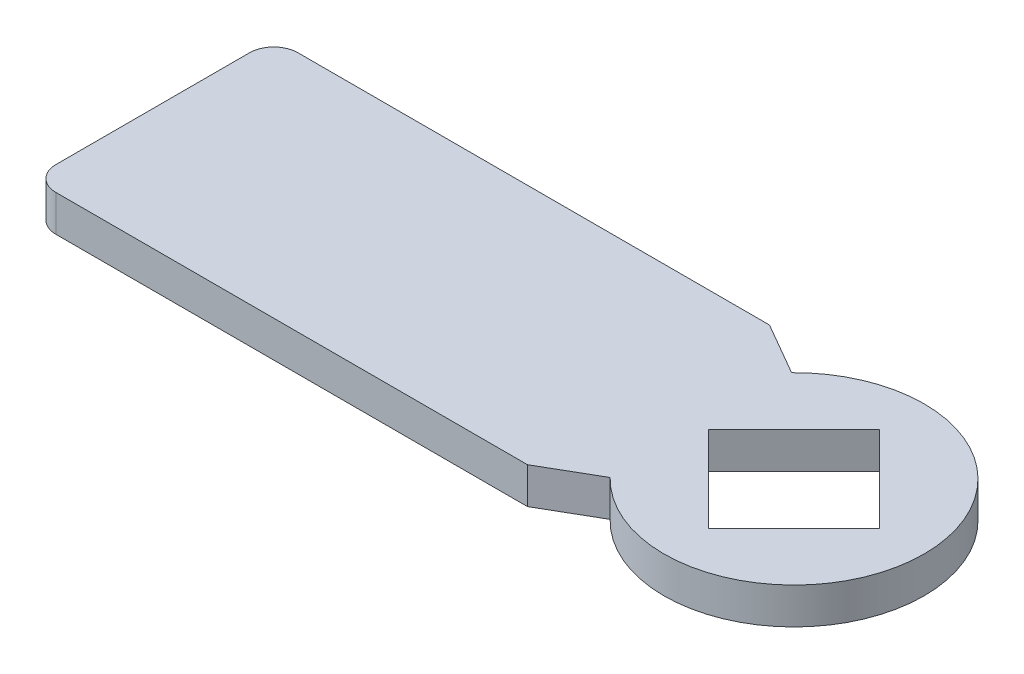
ISO-10303-21;
HEADER;
FILE_DESCRIPTION(('STEP AP214'),'2;1');
FILE_NAME('part.step','',(''),(''),'','','');
FILE_SCHEMA(('AUTOMOTIVE_DESIGN { 1 0 10303 214 1 1 1 1 }'));
ENDSEC;
DATA;
#1=APPLICATION_CONTEXT('core data for automotive mechanical design processes');
#2=APPLICATION_PROTOCOL_DEFINITION('international standard','automotive_design',2000,#1);
#3=PRODUCT_CONTEXT('',#1,'mechanical');
#4=PRODUCT('Part','Part','',(#3));
#5=PRODUCT_RELATED_PRODUCT_CATEGORY('part','',(#4));
#6=PRODUCT_DEFINITION_FORMATION('','',#4);
#7=PRODUCT_DEFINITION_CONTEXT('part definition',#1,'design');
#8=PRODUCT_DEFINITION('design','',#6,#7);
#9=PRODUCT_DEFINITION_SHAPE('','',#8);
#10=(LENGTH_UNIT() NAMED_UNIT(*) SI_UNIT(.MILLI.,.METRE.));
#11=(NAMED_UNIT(*) PLANE_ANGLE_UNIT() SI_UNIT($,.RADIAN.));
#12=(NAMED_UNIT(*) SI_UNIT($,.STERADIAN.) SOLID_ANGLE_UNIT());
#13=UNCERTAINTY_MEASURE_WITH_UNIT(LENGTH_MEASURE(1.E-05),#10,'distance_accuracy_value','');
#14=(GEOMETRIC_REPRESENTATION_CONTEXT(3) GLOBAL_UNCERTAINTY_ASSIGNED_CONTEXT((#13)) GLOBAL_UNIT_ASSIGNED_CONTEXT((#10,
#11,#12)) REPRESENTATION_CONTEXT('',''));
#15=CARTESIAN_POINT('',(0.,0.,0.));
#16=DIRECTION('',(0.,0.,1.));
#17=DIRECTION('',(1.,0.,0.));
#18=AXIS2_PLACEMENT_3D('',#15,#16,#17);
#19=CARTESIAN_POINT('',(-53.,3.,-10.));
#20=DIRECTION('',(1.,0.,0.));
#21=DIRECTION('',(0.,0.,-1.));
#22=AXIS2_PLACEMENT_3D('',#19,#20,#21);
#23=PLANE('',#22);
#24=DIRECTION('',(0.,0.,1.));
#25=VECTOR('',#24,1.);
#26=CARTESIAN_POINT('',(-53.,3.,-10.));
#27=LINE('',#26,#25);
#28=CARTESIAN_POINT('',(-53.,3.,-8.));
#29=VERTEX_POINT('',#28);
#30=CARTESIAN_POINT('',(-53.,3.,8.));
#31=VERTEX_POINT('',#30);
#32=EDGE_CURVE('E162',#29,#31,#27,.T.);
#33=ORIENTED_EDGE('',*,*,#32,.F.);
#34=DIRECTION('',(0.,-1.,0.));
#35=VECTOR('',#34,1.);
#36=CARTESIAN_POINT('',(-53.,3.,-8.));
#37=LINE('',#36,#35);
#38=CARTESIAN_POINT('',(-53.,0.,-8.));
#39=VERTEX_POINT('',#38);
#40=EDGE_CURVE('E203',#29,#39,#37,.T.);
#41=ORIENTED_EDGE('',*,*,#40,.T.);
#42=DIRECTION('',(0.,0.,1.));
#43=VECTOR('',#42,1.);
#44=CARTESIAN_POINT('',(-53.,0.,-10.));
#45=LINE('',#44,#43);
#46=CARTESIAN_POINT('',(-53.,0.,8.));
#47=VERTEX_POINT('',#46);
#48=EDGE_CURVE('E158',#39,#47,#45,.T.);
#49=ORIENTED_EDGE('',*,*,#48,.T.);
#50=DIRECTION('',(0.,-1.,0.));
#51=VECTOR('',#50,1.);
#52=CARTESIAN_POINT('',(-53.,3.,8.));
#53=LINE('',#52,#51);
#54=EDGE_CURVE('E201',#47,#31,#53,.F.);
#55=ORIENTED_EDGE('',*,*,#54,.T.);
#56=EDGE_LOOP('',(#33,#41,#49,#55));
#57=FACE_BOUND('',#56,.T.);
#58=ADVANCED_FACE('F36',(#57),#23,.F.);
#59=CARTESIAN_POINT('',(-53.,3.,10.));
#60=DIRECTION('',(0.,0.,-1.));
#61=DIRECTION('',(-1.,0.,0.));
#62=AXIS2_PLACEMENT_3D('',#59,#60,#61);
#63=PLANE('',#62);
#64=DIRECTION('',(1.,0.,0.));
#65=VECTOR('',#64,1.);
#66=CARTESIAN_POINT('',(-53.,3.,10.));
#67=LINE('',#66,#65);
#68=CARTESIAN_POINT('',(-51.,3.,10.));
#69=VERTEX_POINT('',#68);
#70=CARTESIAN_POINT('',(-12.0315879192969,3.,9.99999999999999));
#71=VERTEX_POINT('',#70);
#72=EDGE_CURVE('E165',#69,#71,#67,.T.);
#73=ORIENTED_EDGE('',*,*,#72,.F.);
#74=DIRECTION('',(0.,-1.,0.));
#75=VECTOR('',#74,1.);
#76=CARTESIAN_POINT('',(-51.,3.,10.));
#77=LINE('',#76,#75);
#78=CARTESIAN_POINT('',(-51.,0.,10.));
#79=VERTEX_POINT('',#78);
#80=EDGE_CURVE('E11',#69,#79,#77,.T.);
#81=ORIENTED_EDGE('',*,*,#80,.T.);
#82=DIRECTION('',(1.,0.,0.));
#83=VECTOR('',#82,1.);
#84=CARTESIAN_POINT('',(-53.,0.,10.));
#85=LINE('',#84,#83);
#86=CARTESIAN_POINT('',(-12.0315879192969,0.,9.99999999999999));
#87=VERTEX_POINT('',#86);
#88=EDGE_CURVE('E180',#79,#87,#85,.T.);
#89=ORIENTED_EDGE('',*,*,#88,.T.);
#90=DIRECTION('',(0.,-1.,0.));
#91=VECTOR('',#90,1.);
#92=CARTESIAN_POINT('',(-12.0315879192969,3.,9.99999999999999));
#93=LINE('',#92,#91);
#94=EDGE_CURVE('E198',#71,#87,#93,.T.);
#95=ORIENTED_EDGE('',*,*,#94,.F.);
#96=EDGE_LOOP('',(#73,#81,#89,#95));
#97=FACE_BOUND('',#96,.T.);
#98=ADVANCED_FACE('F248',(#97),#63,.F.);
#99=CARTESIAN_POINT('',(-12.0315879192969,3.,9.99999999999999));
#100=DIRECTION('',(-0.500000000000001,0.,-0.866025403784438));
#101=DIRECTION('',(-0.866025403784438,0.,0.500000000000001));
#102=AXIS2_PLACEMENT_3D('',#99,#100,#101);
#103=PLANE('',#102);
#104=DIRECTION('',(0.866025403784438,0.,-0.500000000000001));
#105=VECTOR('',#104,1.);
#106=CARTESIAN_POINT('',(-12.0315879192969,0.,9.99999999999999));
#107=LINE('',#106,#105);
#108=CARTESIAN_POINT('',(-7.70146090037469,0.,7.5));
#109=VERTEX_POINT('',#108);
#110=EDGE_CURVE('E182',#87,#109,#107,.T.);
#111=ORIENTED_EDGE('',*,*,#110,.T.);
#112=DIRECTION('',(0.,-1.,0.));
#113=VECTOR('',#112,1.);
#114=CARTESIAN_POINT('',(-7.70146090037469,3.,7.5));
#115=LINE('',#114,#113);
#116=CARTESIAN_POINT('',(-7.70146090037469,3.,7.5));
#117=VERTEX_POINT('',#116);
#118=EDGE_CURVE('E195',#117,#109,#115,.T.);
#119=ORIENTED_EDGE('',*,*,#118,.F.);
#120=DIRECTION('',(0.866025403784438,0.,-0.500000000000001));
#121=VECTOR('',#120,1.);
#122=CARTESIAN_POINT('',(-12.0315879192969,3.,9.99999999999999));
#123=LINE('',#122,#121);
#124=EDGE_CURVE('E168',#71,#117,#123,.T.);
#125=ORIENTED_EDGE('',*,*,#124,.F.);
#126=ORIENTED_EDGE('',*,*,#94,.T.);
#127=EDGE_LOOP('',(#111,#119,#125,#126));
#128=FACE_BOUND('',#127,.T.);
#129=ADVANCED_FACE('F244',(#128),#103,.F.);
#130=CARTESIAN_POINT('',(0.,3.,0.));
#131=DIRECTION('',(0.,-1.,0.));
#132=DIRECTION('',(0.,0.,-1.));
#133=AXIS2_PLACEMENT_3D('',#130,#131,#132);
#134=CYLINDRICAL_SURFACE('',#133,10.75);
#135=CARTESIAN_POINT('',(0.,0.,0.));
#136=DIRECTION('',(0.,1.,0.));
#137=DIRECTION('',(0.,0.,1.));
#138=AXIS2_PLACEMENT_3D('',#135,#136,#137);
#139=CIRCLE('',#138,10.75);
#140=CARTESIAN_POINT('',(-7.70146090037469,0.,-7.49999999999999));
#141=VERTEX_POINT('',#140);
#142=EDGE_CURVE('E184',#109,#141,#139,.T.);
#143=ORIENTED_EDGE('',*,*,#142,.T.);
#144=DIRECTION('',(0.,-1.,0.));
#145=VECTOR('',#144,1.);
#146=CARTESIAN_POINT('',(-7.70146090037469,3.,-7.49999999999999));
#147=LINE('',#146,#145);
#148=CARTESIAN_POINT('',(-7.70146090037469,3.,-7.49999999999999));
#149=VERTEX_POINT('',#148);
#150=EDGE_CURVE('E192',#149,#141,#147,.T.);
#151=ORIENTED_EDGE('',*,*,#150,.F.);
#152=CARTESIAN_POINT('',(0.,3.,0.));
#153=DIRECTION('',(0.,1.,0.));
#154=DIRECTION('',(0.,0.,1.));
#155=AXIS2_PLACEMENT_3D('',#152,#153,#154);
#156=CIRCLE('',#155,10.75);
#157=EDGE_CURVE('E170',#117,#149,#156,.T.);
#158=ORIENTED_EDGE('',*,*,#157,.F.);
#159=ORIENTED_EDGE('',*,*,#118,.T.);
#160=EDGE_LOOP('',(#143,#151,#158,#159));
#161=FACE_BOUND('',#160,.T.);
#162=ADVANCED_FACE('F239',(#161),#134,.T.);
#163=CARTESIAN_POINT('',(-12.0315879192969,3.,-9.99999999999999));
#164=DIRECTION('',(-0.500000000000001,0.,0.866025403784438));
#165=DIRECTION('',(0.866025403784438,0.,0.500000000000001));
#166=AXIS2_PLACEMENT_3D('',#163,#164,#165);
#167=PLANE('',#166);
#168=DIRECTION('',(-0.866025403784438,0.,-0.500000000000001));
#169=VECTOR('',#168,1.);
#170=CARTESIAN_POINT('',(-12.0315879192969,0.,-9.99999999999999));
#171=LINE('',#170,#169);
#172=CARTESIAN_POINT('',(-12.0315879192969,0.,-9.99999999999999));
#173=VERTEX_POINT('',#172);
#174=EDGE_CURVE('E186',#141,#173,#171,.T.);
#175=ORIENTED_EDGE('',*,*,#174,.T.);
#176=DIRECTION('',(0.,-1.,0.));
#177=VECTOR('',#176,1.);
#178=CARTESIAN_POINT('',(-12.0315879192969,3.,-9.99999999999999));
#179=LINE('',#178,#177);
#180=CARTESIAN_POINT('',(-12.0315879192969,3.,-9.99999999999999));
#181=VERTEX_POINT('',#180);
#182=EDGE_CURVE('E177',#181,#173,#179,.T.);
#183=ORIENTED_EDGE('',*,*,#182,.F.);
#184=DIRECTION('',(-0.866025403784438,0.,-0.500000000000001));
#185=VECTOR('',#184,1.);
#186=CARTESIAN_POINT('',(-12.0315879192969,3.,-9.99999999999999));
#187=LINE('',#186,#185);
#188=EDGE_CURVE('E172',#149,#181,#187,.T.);
#189=ORIENTED_EDGE('',*,*,#188,.F.);
#190=ORIENTED_EDGE('',*,*,#150,.T.);
#191=EDGE_LOOP('',(#175,#183,#189,#190));
#192=FACE_BOUND('',#191,.T.);
#193=ADVANCED_FACE('F233',(#192),#167,.F.);
#194=CARTESIAN_POINT('',(-53.,3.,-10.));
#195=DIRECTION('',(0.,0.,1.));
#196=DIRECTION('',(1.,0.,0.));
#197=AXIS2_PLACEMENT_3D('',#194,#195,#196);
#198=PLANE('',#197);
#199=DIRECTION('',(-1.,0.,0.));
#200=VECTOR('',#199,1.);
#201=CARTESIAN_POINT('',(-53.,0.,-10.));
#202=LINE('',#201,#200);
#203=CARTESIAN_POINT('',(-51.,0.,-10.));
#204=VERTEX_POINT('',#203);
#205=EDGE_CURVE('E166',#173,#204,#202,.T.);
#206=ORIENTED_EDGE('',*,*,#205,.T.);
#207=DIRECTION('',(0.,-1.,0.));
#208=VECTOR('',#207,1.);
#209=CARTESIAN_POINT('',(-51.,3.,-10.));
#210=LINE('',#209,#208);
#211=CARTESIAN_POINT('',(-51.,3.,-10.));
#212=VERTEX_POINT('',#211);
#213=EDGE_CURVE('E210',#204,#212,#210,.F.);
#214=ORIENTED_EDGE('',*,*,#213,.T.);
#215=DIRECTION('',(-1.,0.,0.));
#216=VECTOR('',#215,1.);
#217=CARTESIAN_POINT('',(-53.,3.,-10.));
#218=LINE('',#217,#216);
#219=EDGE_CURVE('E174',#181,#212,#218,.T.);
#220=ORIENTED_EDGE('',*,*,#219,.F.);
#221=ORIENTED_EDGE('',*,*,#182,.T.);
#222=EDGE_LOOP('',(#206,#214,#220,#221));
#223=FACE_BOUND('',#222,.T.);
#224=ADVANCED_FACE('F229',(#223),#198,.F.);
#225=CARTESIAN_POINT('',(0.,3.,0.));
#226=DIRECTION('',(0.,1.,0.));
#227=DIRECTION('',(0.,0.,1.));
#228=AXIS2_PLACEMENT_3D('',#225,#226,#227);
#229=PLANE('',#228);
#230=DIRECTION('',(-0.707106781186548,0.,-0.707106781186548));
#231=VECTOR('',#230,1.);
#232=CARTESIAN_POINT('',(7.07106781186548,3.,0.));
#233=LINE('',#232,#231);
#234=CARTESIAN_POINT('',(7.07106781186548,3.,0.));
#235=VERTEX_POINT('',#234);
#236=CARTESIAN_POINT('',(0.,3.,-7.07106781186548));
#237=VERTEX_POINT('',#236);
#238=EDGE_CURVE('E51',#235,#237,#233,.T.);
#239=ORIENTED_EDGE('',*,*,#238,.F.);
#240=DIRECTION('',(0.707106781186548,0.,-0.707106781186548));
#241=VECTOR('',#240,1.);
#242=CARTESIAN_POINT('',(0.,3.,7.07106781186547));
#243=LINE('',#242,#241);
#244=CARTESIAN_POINT('',(0.,3.,7.07106781186547));
#245=VERTEX_POINT('',#244);
#246=EDGE_CURVE('E143',#245,#235,#243,.T.);
#247=ORIENTED_EDGE('',*,*,#246,.F.);
#248=DIRECTION('',(0.707106781186548,0.,0.707106781186548));
#249=VECTOR('',#248,1.);
#250=CARTESIAN_POINT('',(-7.07106781186548,3.,0.));
#251=LINE('',#250,#249);
#252=CARTESIAN_POINT('',(-7.07106781186548,3.,0.));
#253=VERTEX_POINT('',#252);
#254=EDGE_CURVE('E146',#253,#245,#251,.T.);
#255=ORIENTED_EDGE('',*,*,#254,.F.);
#256=DIRECTION('',(-0.707106781186548,0.,0.707106781186548));
#257=VECTOR('',#256,1.);
#258=CARTESIAN_POINT('',(0.,3.,-7.07106781186548));
#259=LINE('',#258,#257);
#260=EDGE_CURVE('E152',#237,#253,#259,.T.);
#261=ORIENTED_EDGE('',*,*,#260,.F.);
#262=EDGE_LOOP('',(#239,#247,#255,#261));
#263=FACE_BOUND('',#262,.T.);
#264=ORIENTED_EDGE('',*,*,#219,.T.);
#265=CARTESIAN_POINT('',(-51.,3.,-8.));
#266=DIRECTION('',(0.,1.,0.));
#267=DIRECTION('',(0.,0.,1.));
#268=AXIS2_PLACEMENT_3D('',#265,#266,#267);
#269=CIRCLE('',#268,2.);
#270=EDGE_CURVE('E44',#212,#29,#269,.T.);
#271=ORIENTED_EDGE('',*,*,#270,.T.);
#272=ORIENTED_EDGE('',*,*,#32,.T.);
#273=CARTESIAN_POINT('',(-51.,3.,8.));
#274=DIRECTION('',(0.,1.,0.));
#275=DIRECTION('',(0.,0.,1.));
#276=AXIS2_PLACEMENT_3D('',#273,#274,#275);
#277=CIRCLE('',#276,2.);
#278=EDGE_CURVE('E212',#31,#69,#277,.T.);
#279=ORIENTED_EDGE('',*,*,#278,.T.);
#280=ORIENTED_EDGE('',*,*,#72,.T.);
#281=ORIENTED_EDGE('',*,*,#124,.T.);
#282=ORIENTED_EDGE('',*,*,#157,.T.);
#283=ORIENTED_EDGE('',*,*,#188,.T.);
#284=EDGE_LOOP('',(#264,#271,#272,#279,#280,#281,#282,#283));
#285=FACE_BOUND('',#284,.T.);
#286=ADVANCED_FACE('F216',(#263,#285),#229,.T.);
#287=CARTESIAN_POINT('',(0.,0.,0.));
#288=DIRECTION('',(0.,1.,0.));
#289=DIRECTION('',(0.,0.,1.));
#290=AXIS2_PLACEMENT_3D('',#287,#288,#289);
#291=PLANE('',#290);
#292=DIRECTION('',(0.707106781186548,0.,-0.707106781186548));
#293=VECTOR('',#292,1.);
#294=CARTESIAN_POINT('',(0.,0.,7.07106781186547));
#295=LINE('',#294,#293);
#296=CARTESIAN_POINT('',(0.,0.,7.07106781186547));
#297=VERTEX_POINT('',#296);
#298=CARTESIAN_POINT('',(7.07106781186548,0.,0.));
#299=VERTEX_POINT('',#298);
#300=EDGE_CURVE('E133',#297,#299,#295,.T.);
#301=ORIENTED_EDGE('',*,*,#300,.T.);
#302=DIRECTION('',(-0.707106781186548,0.,-0.707106781186548));
#303=VECTOR('',#302,1.);
#304=CARTESIAN_POINT('',(7.07106781186548,0.,0.));
#305=LINE('',#304,#303);
#306=CARTESIAN_POINT('',(0.,0.,-7.07106781186548));
#307=VERTEX_POINT('',#306);
#308=EDGE_CURVE('E127',#299,#307,#305,.T.);
#309=ORIENTED_EDGE('',*,*,#308,.T.);
#310=DIRECTION('',(-0.707106781186548,0.,0.707106781186548));
#311=VECTOR('',#310,1.);
#312=CARTESIAN_POINT('',(0.,0.,-7.07106781186548));
#313=LINE('',#312,#311);
#314=CARTESIAN_POINT('',(-7.07106781186548,0.,0.));
#315=VERTEX_POINT('',#314);
#316=EDGE_CURVE('E136',#307,#315,#313,.T.);
#317=ORIENTED_EDGE('',*,*,#316,.T.);
#318=DIRECTION('',(0.707106781186548,0.,0.707106781186548));
#319=VECTOR('',#318,1.);
#320=CARTESIAN_POINT('',(-7.07106781186548,0.,0.));
#321=LINE('',#320,#319);
#322=EDGE_CURVE('E59',#315,#297,#321,.T.);
#323=ORIENTED_EDGE('',*,*,#322,.T.);
#324=EDGE_LOOP('',(#301,#309,#317,#323));
#325=FACE_BOUND('',#324,.T.);
#326=ORIENTED_EDGE('',*,*,#48,.F.);
#327=CARTESIAN_POINT('',(-51.,0.,-8.));
#328=DIRECTION('',(0.,1.,0.));
#329=DIRECTION('',(0.,0.,1.));
#330=AXIS2_PLACEMENT_3D('',#327,#328,#329);
#331=CIRCLE('',#330,2.);
#332=EDGE_CURVE('E208',#39,#204,#331,.F.);
#333=ORIENTED_EDGE('',*,*,#332,.T.);
#334=ORIENTED_EDGE('',*,*,#205,.F.);
#335=ORIENTED_EDGE('',*,*,#174,.F.);
#336=ORIENTED_EDGE('',*,*,#142,.F.);
#337=ORIENTED_EDGE('',*,*,#110,.F.);
#338=ORIENTED_EDGE('',*,*,#88,.F.);
#339=CARTESIAN_POINT('',(-51.,0.,8.));
#340=DIRECTION('',(0.,1.,0.));
#341=DIRECTION('',(0.,0.,1.));
#342=AXIS2_PLACEMENT_3D('',#339,#340,#341);
#343=CIRCLE('',#342,2.);
#344=EDGE_CURVE('E206',#79,#47,#343,.F.);
#345=ORIENTED_EDGE('',*,*,#344,.T.);
#346=EDGE_LOOP('',(#326,#333,#334,#335,#336,#337,#338,#345));
#347=FACE_BOUND('',#346,.T.);
#348=ADVANCED_FACE('F140',(#325,#347),#291,.F.);
#349=CARTESIAN_POINT('',(-51.,3.,-8.));
#350=DIRECTION('',(0.,-1.,0.));
#351=DIRECTION('',(0.,0.,-1.));
#352=AXIS2_PLACEMENT_3D('',#349,#350,#351);
#353=CYLINDRICAL_SURFACE('',#352,2.);
#354=ORIENTED_EDGE('',*,*,#270,.F.);
#355=ORIENTED_EDGE('',*,*,#213,.F.);
#356=ORIENTED_EDGE('',*,*,#332,.F.);
#357=ORIENTED_EDGE('',*,*,#40,.F.);
#358=EDGE_LOOP('',(#354,#355,#356,#357));
#359=FACE_BOUND('',#358,.T.);
#360=ADVANCED_FACE('F225',(#359),#353,.T.);
#361=CARTESIAN_POINT('',(-51.,3.,8.));
#362=DIRECTION('',(0.,-1.,0.));
#363=DIRECTION('',(0.,0.,-1.));
#364=AXIS2_PLACEMENT_3D('',#361,#362,#363);
#365=CYLINDRICAL_SURFACE('',#364,2.);
#366=ORIENTED_EDGE('',*,*,#278,.F.);
#367=ORIENTED_EDGE('',*,*,#54,.F.);
#368=ORIENTED_EDGE('',*,*,#344,.F.);
#369=ORIENTED_EDGE('',*,*,#80,.F.);
#370=EDGE_LOOP('',(#366,#367,#368,#369));
#371=FACE_BOUND('',#370,.T.);
#372=ADVANCED_FACE('F38',(#371),#365,.T.);
#373=CARTESIAN_POINT('',(7.07106781186548,0.,0.));
#374=DIRECTION('',(0.707106781186547,0.,-0.707106781186547));
#375=DIRECTION('',(-0.707106781186548,0.,-0.707106781186548));
#376=AXIS2_PLACEMENT_3D('',#373,#374,#375);
#377=PLANE('',#376);
#378=ORIENTED_EDGE('',*,*,#238,.T.);
#379=DIRECTION('',(0.,1.,0.));
#380=VECTOR('',#379,1.);
#381=CARTESIAN_POINT('',(0.,0.,-7.07106781186548));
#382=LINE('',#381,#380);
#383=EDGE_CURVE('E123',#307,#237,#382,.T.);
#384=ORIENTED_EDGE('',*,*,#383,.F.);
#385=ORIENTED_EDGE('',*,*,#308,.F.);
#386=DIRECTION('',(0.,1.,0.));
#387=VECTOR('',#386,1.);
#388=CARTESIAN_POINT('',(7.07106781186548,0.,0.));
#389=LINE('',#388,#387);
#390=EDGE_CURVE('E156',#299,#235,#389,.T.);
#391=ORIENTED_EDGE('',*,*,#390,.T.);
#392=EDGE_LOOP('',(#378,#384,#385,#391));
#393=FACE_BOUND('',#392,.T.);
#394=ADVANCED_FACE('F125',(#393),#377,.F.);
#395=CARTESIAN_POINT('',(0.,0.,7.07106781186547));
#396=DIRECTION('',(0.707106781186547,0.,0.707106781186547));
#397=DIRECTION('',(0.707106781186548,0.,-0.707106781186548));
#398=AXIS2_PLACEMENT_3D('',#395,#396,#397);
#399=PLANE('',#398);
#400=ORIENTED_EDGE('',*,*,#246,.T.);
#401=ORIENTED_EDGE('',*,*,#390,.F.);
#402=ORIENTED_EDGE('',*,*,#300,.F.);
#403=DIRECTION('',(0.,1.,0.));
#404=VECTOR('',#403,1.);
#405=CARTESIAN_POINT('',(0.,0.,7.07106781186547));
#406=LINE('',#405,#404);
#407=EDGE_CURVE('E159',#297,#245,#406,.T.);
#408=ORIENTED_EDGE('',*,*,#407,.T.);
#409=EDGE_LOOP('',(#400,#401,#402,#408));
#410=FACE_BOUND('',#409,.T.);
#411=ADVANCED_FACE('F256',(#410),#399,.F.);
#412=CARTESIAN_POINT('',(-7.07106781186548,0.,0.));
#413=DIRECTION('',(-0.707106781186547,0.,0.707106781186547));
#414=DIRECTION('',(0.707106781186548,0.,0.707106781186548));
#415=AXIS2_PLACEMENT_3D('',#412,#413,#414);
#416=PLANE('',#415);
#417=ORIENTED_EDGE('',*,*,#254,.T.);
#418=ORIENTED_EDGE('',*,*,#407,.F.);
#419=ORIENTED_EDGE('',*,*,#322,.F.);
#420=DIRECTION('',(0.,1.,0.));
#421=VECTOR('',#420,1.);
#422=CARTESIAN_POINT('',(-7.07106781186548,0.,0.));
#423=LINE('',#422,#421);
#424=EDGE_CURVE('E132',#315,#253,#423,.T.);
#425=ORIENTED_EDGE('',*,*,#424,.T.);
#426=EDGE_LOOP('',(#417,#418,#419,#425));
#427=FACE_BOUND('',#426,.T.);
#428=ADVANCED_FACE('F280',(#427),#416,.F.);
#429=CARTESIAN_POINT('',(0.,0.,-7.07106781186548));
#430=DIRECTION('',(-0.707106781186547,0.,-0.707106781186547));
#431=DIRECTION('',(-0.707106781186548,0.,0.707106781186548));
#432=AXIS2_PLACEMENT_3D('',#429,#430,#431);
#433=PLANE('',#432);
#434=ORIENTED_EDGE('',*,*,#260,.T.);
#435=ORIENTED_EDGE('',*,*,#424,.F.);
#436=ORIENTED_EDGE('',*,*,#316,.F.);
#437=ORIENTED_EDGE('',*,*,#383,.T.);
#438=EDGE_LOOP('',(#434,#435,#436,#437));
#439=FACE_BOUND('',#438,.T.);
#440=ADVANCED_FACE('F137',(#439),#433,.F.);
#441=CLOSED_SHELL('',(#58,#98,#129,#162,#193,#224,#286,#348,#360,#372,#394,#411,#428,#440));
#442=MANIFOLD_SOLID_BREP('B2',#441);
#443=ADVANCED_BREP_SHAPE_REPRESENTATION('',(#18,#442),#14);
#444=SHAPE_DEFINITION_REPRESENTATION(#9,#443);
ENDSEC;
END-ISO-10303-21;
